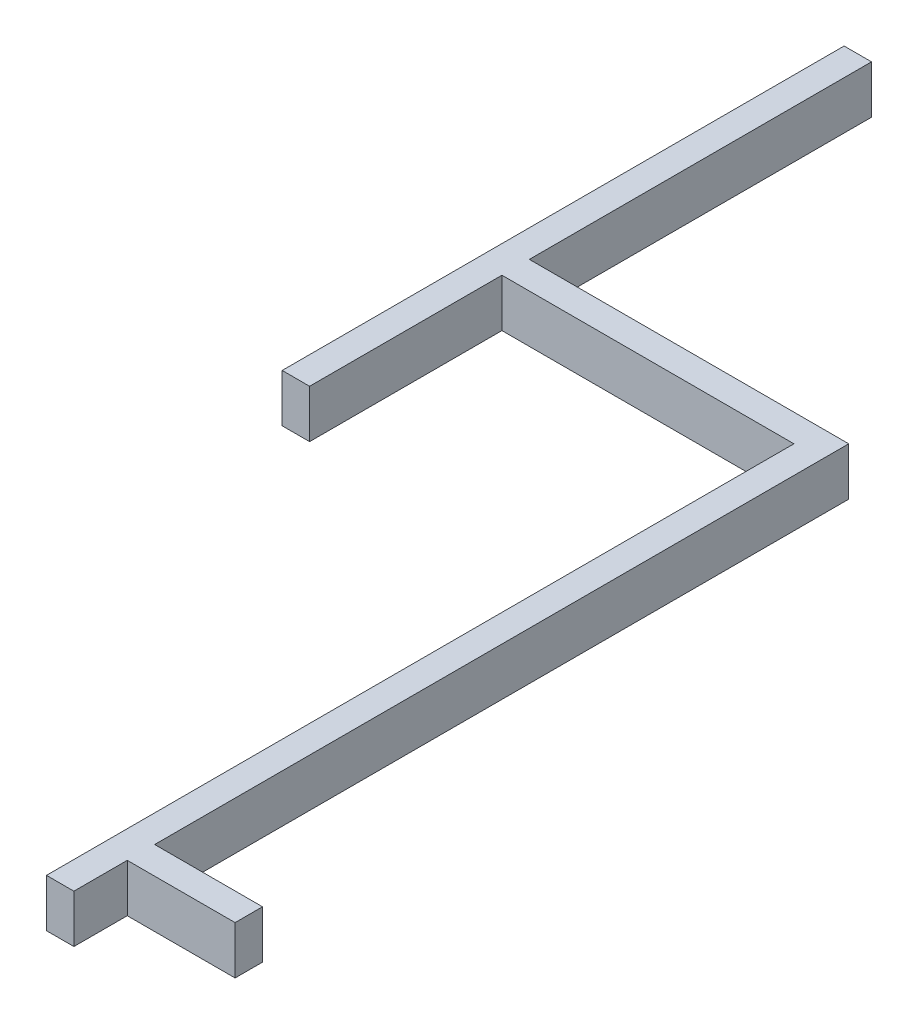
ISO-10303-21;
HEADER;
FILE_DESCRIPTION(('STEP AP214'),'2;1');
FILE_NAME('part.step','',(''),(''),'','','');
FILE_SCHEMA(('AUTOMOTIVE_DESIGN { 1 0 10303 214 1 1 1 1 }'));
ENDSEC;
DATA;
#1=APPLICATION_CONTEXT('core data for automotive mechanical design processes');
#2=APPLICATION_PROTOCOL_DEFINITION('international standard','automotive_design',2000,#1);
#3=PRODUCT_CONTEXT('',#1,'mechanical');
#4=PRODUCT('Part','Part','',(#3));
#5=PRODUCT_RELATED_PRODUCT_CATEGORY('part','',(#4));
#6=PRODUCT_DEFINITION_FORMATION('','',#4);
#7=PRODUCT_DEFINITION_CONTEXT('part definition',#1,'design');
#8=PRODUCT_DEFINITION('design','',#6,#7);
#9=PRODUCT_DEFINITION_SHAPE('','',#8);
#10=(LENGTH_UNIT() NAMED_UNIT(*) SI_UNIT(.MILLI.,.METRE.));
#11=(NAMED_UNIT(*) PLANE_ANGLE_UNIT() SI_UNIT($,.RADIAN.));
#12=(NAMED_UNIT(*) SI_UNIT($,.STERADIAN.) SOLID_ANGLE_UNIT());
#13=UNCERTAINTY_MEASURE_WITH_UNIT(LENGTH_MEASURE(1.E-05),#10,'distance_accuracy_value','');
#14=(GEOMETRIC_REPRESENTATION_CONTEXT(3) GLOBAL_UNCERTAINTY_ASSIGNED_CONTEXT((#13)) GLOBAL_UNIT_ASSIGNED_CONTEXT((#10,
#11,#12)) REPRESENTATION_CONTEXT('',''));
#15=CARTESIAN_POINT('',(0.,0.,0.));
#16=DIRECTION('',(0.,0.,1.));
#17=DIRECTION('',(1.,0.,0.));
#18=AXIS2_PLACEMENT_3D('',#15,#16,#17);
#19=CARTESIAN_POINT('',(0.,8.5,0.));
#20=DIRECTION('',(0.,1.,0.));
#21=DIRECTION('',(0.,0.,1.));
#22=AXIS2_PLACEMENT_3D('',#19,#20,#21);
#23=PLANE('',#22);
#24=DIRECTION('',(0.,0.,1.));
#25=VECTOR('',#24,1.);
#26=CARTESIAN_POINT('',(21.7271359769322,8.5,-62.4202218490347));
#27=LINE('',#26,#25);
#28=CARTESIAN_POINT('',(21.7271359769322,8.5,-62.4202218490347));
#29=VERTEX_POINT('',#28);
#30=CARTESIAN_POINT('',(21.7271359769322,8.5,46.6315684002395));
#31=VERTEX_POINT('',#30);
#32=EDGE_CURVE('E197',#29,#31,#27,.T.);
#33=ORIENTED_EDGE('',*,*,#32,.T.);
#34=DIRECTION('',(1.,0.,0.));
#35=VECTOR('',#34,1.);
#36=CARTESIAN_POINT('',(21.7271359769322,8.5,46.6315684002395));
#37=LINE('',#36,#35);
#38=CARTESIAN_POINT('',(25.7271359769322,8.5,46.6315684002395));
#39=VERTEX_POINT('',#38);
#40=EDGE_CURVE('E155',#31,#39,#37,.T.);
#41=ORIENTED_EDGE('',*,*,#40,.T.);
#42=DIRECTION('',(0.,0.,-1.));
#43=VECTOR('',#42,1.);
#44=CARTESIAN_POINT('',(25.7271359769322,8.5,46.6315684002395));
#45=LINE('',#44,#43);
#46=CARTESIAN_POINT('',(25.7271359769322,8.5,38.8445006443693));
#47=VERTEX_POINT('',#46);
#48=EDGE_CURVE('E235',#39,#47,#45,.T.);
#49=ORIENTED_EDGE('',*,*,#48,.T.);
#50=DIRECTION('',(1.,0.,0.));
#51=VECTOR('',#50,1.);
#52=CARTESIAN_POINT('',(25.7271359769322,8.5,38.8445006443693));
#53=LINE('',#52,#51);
#54=CARTESIAN_POINT('',(41.4595117428691,8.5,38.8445006443693));
#55=VERTEX_POINT('',#54);
#56=EDGE_CURVE('E237',#47,#55,#53,.T.);
#57=ORIENTED_EDGE('',*,*,#56,.T.);
#58=DIRECTION('',(0.,0.,-1.));
#59=VECTOR('',#58,1.);
#60=CARTESIAN_POINT('',(41.4595117428691,8.5,38.8445006443693));
#61=LINE('',#60,#59);
#62=CARTESIAN_POINT('',(41.4595117428691,8.5,34.8445006443693));
#63=VERTEX_POINT('',#62);
#64=EDGE_CURVE('E239',#55,#63,#61,.T.);
#65=ORIENTED_EDGE('',*,*,#64,.T.);
#66=DIRECTION('',(-1.,0.,0.));
#67=VECTOR('',#66,1.);
#68=CARTESIAN_POINT('',(41.4595117428691,8.5,34.8445006443693));
#69=LINE('',#68,#67);
#70=CARTESIAN_POINT('',(25.7271359769322,8.5,34.8445006443693));
#71=VERTEX_POINT('',#70);
#72=EDGE_CURVE('E245',#63,#71,#69,.T.);
#73=ORIENTED_EDGE('',*,*,#72,.T.);
#74=DIRECTION('',(0.,0.,-1.));
#75=VECTOR('',#74,1.);
#76=CARTESIAN_POINT('',(25.7271359769322,8.5,34.8445006443693));
#77=LINE('',#76,#75);
#78=CARTESIAN_POINT('',(25.7271359769322,8.5,-66.4202218490347));
#79=VERTEX_POINT('',#78);
#80=EDGE_CURVE('E247',#71,#79,#77,.T.);
#81=ORIENTED_EDGE('',*,*,#80,.T.);
#82=DIRECTION('',(-1.,0.,0.));
#83=VECTOR('',#82,1.);
#84=CARTESIAN_POINT('',(25.7271359769322,8.5,-66.4202218490347));
#85=LINE('',#84,#83);
#86=CARTESIAN_POINT('',(-20.8725593297671,8.5,-66.4202218490347));
#87=VERTEX_POINT('',#86);
#88=EDGE_CURVE('E249',#79,#87,#85,.T.);
#89=ORIENTED_EDGE('',*,*,#88,.T.);
#90=DIRECTION('',(0.,0.,-1.));
#91=VECTOR('',#90,1.);
#92=CARTESIAN_POINT('',(-20.8725593297671,8.5,-66.4202218490347));
#93=LINE('',#92,#91);
#94=CARTESIAN_POINT('',(-20.8725593297671,8.5,-116.344219932516));
#95=VERTEX_POINT('',#94);
#96=EDGE_CURVE('E251',#87,#95,#93,.T.);
#97=ORIENTED_EDGE('',*,*,#96,.T.);
#98=DIRECTION('',(-1.,0.,0.));
#99=VECTOR('',#98,1.);
#100=CARTESIAN_POINT('',(-20.8725593297671,8.5,-116.344219932516));
#101=LINE('',#100,#99);
#102=CARTESIAN_POINT('',(-24.8725593297671,8.5,-116.344219932516));
#103=VERTEX_POINT('',#102);
#104=EDGE_CURVE('E253',#95,#103,#101,.T.);
#105=ORIENTED_EDGE('',*,*,#104,.T.);
#106=DIRECTION('',(0.,0.,1.));
#107=VECTOR('',#106,1.);
#108=CARTESIAN_POINT('',(-24.8725593297671,8.5,-116.344219932516));
#109=LINE('',#108,#107);
#110=CARTESIAN_POINT('',(-24.8725593297671,8.5,-34.3580383260494));
#111=VERTEX_POINT('',#110);
#112=EDGE_CURVE('E255',#103,#111,#109,.T.);
#113=ORIENTED_EDGE('',*,*,#112,.T.);
#114=DIRECTION('',(1.,0.,0.));
#115=VECTOR('',#114,1.);
#116=CARTESIAN_POINT('',(-24.8725593297671,8.5,-34.3580383260494));
#117=LINE('',#116,#115);
#118=CARTESIAN_POINT('',(-20.8725593297671,8.5,-34.3580383260494));
#119=VERTEX_POINT('',#118);
#120=EDGE_CURVE('E257',#111,#119,#117,.T.);
#121=ORIENTED_EDGE('',*,*,#120,.T.);
#122=DIRECTION('',(0.,0.,-1.));
#123=VECTOR('',#122,1.);
#124=CARTESIAN_POINT('',(-20.8725593297671,8.5,-34.3580383260494));
#125=LINE('',#124,#123);
#126=CARTESIAN_POINT('',(-20.8725593297671,8.5,-62.4202218490347));
#127=VERTEX_POINT('',#126);
#128=EDGE_CURVE('E258',#119,#127,#125,.T.);
#129=ORIENTED_EDGE('',*,*,#128,.T.);
#130=DIRECTION('',(1.,0.,0.));
#131=VECTOR('',#130,1.);
#132=CARTESIAN_POINT('',(-20.8725593297671,8.5,-62.4202218490347));
#133=LINE('',#132,#131);
#134=EDGE_CURVE('E61',#127,#29,#133,.T.);
#135=ORIENTED_EDGE('',*,*,#134,.T.);
#136=EDGE_LOOP('',(#33,#41,#49,#57,#65,#73,#81,#89,#97,#105,#113,#121,#129,#135));
#137=FACE_BOUND('',#136,.T.);
#138=ADVANCED_FACE('F45',(#137),#23,.T.);
#139=CARTESIAN_POINT('',(25.7271359769322,8.5,46.6315684002395));
#140=DIRECTION('',(-1.,0.,0.));
#141=DIRECTION('',(0.,0.,1.));
#142=AXIS2_PLACEMENT_3D('',#139,#140,#141);
#143=PLANE('',#142);
#144=DIRECTION('',(0.,0.,-1.));
#145=VECTOR('',#144,1.);
#146=CARTESIAN_POINT('',(25.7271359769322,1.5,46.6315684002395));
#147=LINE('',#146,#145);
#148=CARTESIAN_POINT('',(25.7271359769322,1.5,46.6315684002395));
#149=VERTEX_POINT('',#148);
#150=CARTESIAN_POINT('',(25.7271359769322,1.5,38.8445006443693));
#151=VERTEX_POINT('',#150);
#152=EDGE_CURVE('E148',#149,#151,#147,.T.);
#153=ORIENTED_EDGE('',*,*,#152,.T.);
#154=DIRECTION('',(0.,-1.,0.));
#155=VECTOR('',#154,1.);
#156=CARTESIAN_POINT('',(25.7271359769322,8.5,38.8445006443693));
#157=LINE('',#156,#155);
#158=EDGE_CURVE('E229',#47,#151,#157,.T.);
#159=ORIENTED_EDGE('',*,*,#158,.F.);
#160=ORIENTED_EDGE('',*,*,#48,.F.);
#161=DIRECTION('',(0.,-1.,0.));
#162=VECTOR('',#161,1.);
#163=CARTESIAN_POINT('',(25.7271359769322,8.5,46.6315684002395));
#164=LINE('',#163,#162);
#165=EDGE_CURVE('E54',#39,#149,#164,.T.);
#166=ORIENTED_EDGE('',*,*,#165,.T.);
#167=EDGE_LOOP('',(#153,#159,#160,#166));
#168=FACE_BOUND('',#167,.T.);
#169=ADVANCED_FACE('F233',(#168),#143,.F.);
#170=CARTESIAN_POINT('',(25.7271359769322,8.5,38.8445006443693));
#171=DIRECTION('',(0.,0.,-1.));
#172=DIRECTION('',(-1.,0.,0.));
#173=AXIS2_PLACEMENT_3D('',#170,#171,#172);
#174=PLANE('',#173);
#175=DIRECTION('',(1.,0.,0.));
#176=VECTOR('',#175,1.);
#177=CARTESIAN_POINT('',(25.7271359769322,1.5,38.8445006443693));
#178=LINE('',#177,#176);
#179=CARTESIAN_POINT('',(41.4595117428691,1.5,38.8445006443693));
#180=VERTEX_POINT('',#179);
#181=EDGE_CURVE('E165',#151,#180,#178,.T.);
#182=ORIENTED_EDGE('',*,*,#181,.T.);
#183=DIRECTION('',(0.,-1.,0.));
#184=VECTOR('',#183,1.);
#185=CARTESIAN_POINT('',(41.4595117428691,8.5,38.8445006443693));
#186=LINE('',#185,#184);
#187=EDGE_CURVE('E226',#55,#180,#186,.T.);
#188=ORIENTED_EDGE('',*,*,#187,.F.);
#189=ORIENTED_EDGE('',*,*,#56,.F.);
#190=ORIENTED_EDGE('',*,*,#158,.T.);
#191=EDGE_LOOP('',(#182,#188,#189,#190));
#192=FACE_BOUND('',#191,.T.);
#193=ADVANCED_FACE('F299',(#192),#174,.F.);
#194=CARTESIAN_POINT('',(41.4595117428691,8.5,38.8445006443693));
#195=DIRECTION('',(-1.,0.,0.));
#196=DIRECTION('',(0.,0.,1.));
#197=AXIS2_PLACEMENT_3D('',#194,#195,#196);
#198=PLANE('',#197);
#199=DIRECTION('',(0.,0.,-1.));
#200=VECTOR('',#199,1.);
#201=CARTESIAN_POINT('',(41.4595117428691,1.5,38.8445006443693));
#202=LINE('',#201,#200);
#203=CARTESIAN_POINT('',(41.4595117428691,1.5,34.8445006443693));
#204=VERTEX_POINT('',#203);
#205=EDGE_CURVE('E168',#180,#204,#202,.T.);
#206=ORIENTED_EDGE('',*,*,#205,.T.);
#207=DIRECTION('',(0.,-1.,0.));
#208=VECTOR('',#207,1.);
#209=CARTESIAN_POINT('',(41.4595117428691,8.5,34.8445006443693));
#210=LINE('',#209,#208);
#211=EDGE_CURVE('E223',#63,#204,#210,.T.);
#212=ORIENTED_EDGE('',*,*,#211,.F.);
#213=ORIENTED_EDGE('',*,*,#64,.F.);
#214=ORIENTED_EDGE('',*,*,#187,.T.);
#215=EDGE_LOOP('',(#206,#212,#213,#214));
#216=FACE_BOUND('',#215,.T.);
#217=ADVANCED_FACE('F296',(#216),#198,.F.);
#218=CARTESIAN_POINT('',(41.4595117428691,8.5,34.8445006443693));
#219=DIRECTION('',(0.,0.,1.));
#220=DIRECTION('',(1.,0.,0.));
#221=AXIS2_PLACEMENT_3D('',#218,#219,#220);
#222=PLANE('',#221);
#223=DIRECTION('',(-1.,0.,0.));
#224=VECTOR('',#223,1.);
#225=CARTESIAN_POINT('',(41.4595117428691,1.5,34.8445006443693));
#226=LINE('',#225,#224);
#227=CARTESIAN_POINT('',(25.7271359769322,1.5,34.8445006443693));
#228=VERTEX_POINT('',#227);
#229=EDGE_CURVE('E171',#204,#228,#226,.T.);
#230=ORIENTED_EDGE('',*,*,#229,.T.);
#231=DIRECTION('',(0.,-1.,0.));
#232=VECTOR('',#231,1.);
#233=CARTESIAN_POINT('',(25.7271359769322,8.5,34.8445006443693));
#234=LINE('',#233,#232);
#235=EDGE_CURVE('E220',#71,#228,#234,.T.);
#236=ORIENTED_EDGE('',*,*,#235,.F.);
#237=ORIENTED_EDGE('',*,*,#72,.F.);
#238=ORIENTED_EDGE('',*,*,#211,.T.);
#239=EDGE_LOOP('',(#230,#236,#237,#238));
#240=FACE_BOUND('',#239,.T.);
#241=ADVANCED_FACE('F291',(#240),#222,.F.);
#242=CARTESIAN_POINT('',(25.7271359769322,8.5,34.8445006443693));
#243=DIRECTION('',(-1.,0.,0.));
#244=DIRECTION('',(0.,0.,1.));
#245=AXIS2_PLACEMENT_3D('',#242,#243,#244);
#246=PLANE('',#245);
#247=DIRECTION('',(0.,0.,-1.));
#248=VECTOR('',#247,1.);
#249=CARTESIAN_POINT('',(25.7271359769322,1.5,34.8445006443693));
#250=LINE('',#249,#248);
#251=CARTESIAN_POINT('',(25.7271359769322,1.5,-66.4202218490347));
#252=VERTEX_POINT('',#251);
#253=EDGE_CURVE('E174',#228,#252,#250,.T.);
#254=ORIENTED_EDGE('',*,*,#253,.T.);
#255=DIRECTION('',(0.,-1.,0.));
#256=VECTOR('',#255,1.);
#257=CARTESIAN_POINT('',(25.7271359769322,8.5,-66.4202218490347));
#258=LINE('',#257,#256);
#259=EDGE_CURVE('E217',#79,#252,#258,.T.);
#260=ORIENTED_EDGE('',*,*,#259,.F.);
#261=ORIENTED_EDGE('',*,*,#80,.F.);
#262=ORIENTED_EDGE('',*,*,#235,.T.);
#263=EDGE_LOOP('',(#254,#260,#261,#262));
#264=FACE_BOUND('',#263,.T.);
#265=ADVANCED_FACE('F288',(#264),#246,.F.);
#266=CARTESIAN_POINT('',(25.7271359769322,8.5,-66.4202218490347));
#267=DIRECTION('',(0.,0.,1.));
#268=DIRECTION('',(1.,0.,0.));
#269=AXIS2_PLACEMENT_3D('',#266,#267,#268);
#270=PLANE('',#269);
#271=DIRECTION('',(-1.,0.,0.));
#272=VECTOR('',#271,1.);
#273=CARTESIAN_POINT('',(25.7271359769322,1.5,-66.4202218490347));
#274=LINE('',#273,#272);
#275=CARTESIAN_POINT('',(-20.8725593297671,1.5,-66.4202218490347));
#276=VERTEX_POINT('',#275);
#277=EDGE_CURVE('E177',#252,#276,#274,.T.);
#278=ORIENTED_EDGE('',*,*,#277,.T.);
#279=DIRECTION('',(0.,-1.,0.));
#280=VECTOR('',#279,1.);
#281=CARTESIAN_POINT('',(-20.8725593297671,8.5,-66.4202218490347));
#282=LINE('',#281,#280);
#283=EDGE_CURVE('E214',#87,#276,#282,.T.);
#284=ORIENTED_EDGE('',*,*,#283,.F.);
#285=ORIENTED_EDGE('',*,*,#88,.F.);
#286=ORIENTED_EDGE('',*,*,#259,.T.);
#287=EDGE_LOOP('',(#278,#284,#285,#286));
#288=FACE_BOUND('',#287,.T.);
#289=ADVANCED_FACE('F283',(#288),#270,.F.);
#290=CARTESIAN_POINT('',(-20.8725593297671,8.5,-66.4202218490347));
#291=DIRECTION('',(-1.,0.,0.));
#292=DIRECTION('',(0.,0.,1.));
#293=AXIS2_PLACEMENT_3D('',#290,#291,#292);
#294=PLANE('',#293);
#295=DIRECTION('',(0.,0.,-1.));
#296=VECTOR('',#295,1.);
#297=CARTESIAN_POINT('',(-20.8725593297671,1.5,-66.4202218490347));
#298=LINE('',#297,#296);
#299=CARTESIAN_POINT('',(-20.8725593297671,1.5,-116.344219932516));
#300=VERTEX_POINT('',#299);
#301=EDGE_CURVE('E180',#276,#300,#298,.T.);
#302=ORIENTED_EDGE('',*,*,#301,.T.);
#303=DIRECTION('',(0.,-1.,0.));
#304=VECTOR('',#303,1.);
#305=CARTESIAN_POINT('',(-20.8725593297671,8.5,-116.344219932516));
#306=LINE('',#305,#304);
#307=EDGE_CURVE('E211',#95,#300,#306,.T.);
#308=ORIENTED_EDGE('',*,*,#307,.F.);
#309=ORIENTED_EDGE('',*,*,#96,.F.);
#310=ORIENTED_EDGE('',*,*,#283,.T.);
#311=EDGE_LOOP('',(#302,#308,#309,#310));
#312=FACE_BOUND('',#311,.T.);
#313=ADVANCED_FACE('F280',(#312),#294,.F.);
#314=CARTESIAN_POINT('',(-20.8725593297671,8.5,-116.344219932516));
#315=DIRECTION('',(0.,0.,1.));
#316=DIRECTION('',(1.,0.,0.));
#317=AXIS2_PLACEMENT_3D('',#314,#315,#316);
#318=PLANE('',#317);
#319=DIRECTION('',(-1.,0.,0.));
#320=VECTOR('',#319,1.);
#321=CARTESIAN_POINT('',(-20.8725593297671,1.5,-116.344219932516));
#322=LINE('',#321,#320);
#323=CARTESIAN_POINT('',(-24.8725593297671,1.5,-116.344219932516));
#324=VERTEX_POINT('',#323);
#325=EDGE_CURVE('E183',#300,#324,#322,.T.);
#326=ORIENTED_EDGE('',*,*,#325,.T.);
#327=DIRECTION('',(0.,-1.,0.));
#328=VECTOR('',#327,1.);
#329=CARTESIAN_POINT('',(-24.8725593297671,8.5,-116.344219932516));
#330=LINE('',#329,#328);
#331=EDGE_CURVE('E208',#103,#324,#330,.T.);
#332=ORIENTED_EDGE('',*,*,#331,.F.);
#333=ORIENTED_EDGE('',*,*,#104,.F.);
#334=ORIENTED_EDGE('',*,*,#307,.T.);
#335=EDGE_LOOP('',(#326,#332,#333,#334));
#336=FACE_BOUND('',#335,.T.);
#337=ADVANCED_FACE('F275',(#336),#318,.F.);
#338=CARTESIAN_POINT('',(-24.8725593297671,8.5,-116.344219932516));
#339=DIRECTION('',(1.,0.,0.));
#340=DIRECTION('',(0.,0.,-1.));
#341=AXIS2_PLACEMENT_3D('',#338,#339,#340);
#342=PLANE('',#341);
#343=DIRECTION('',(0.,0.,1.));
#344=VECTOR('',#343,1.);
#345=CARTESIAN_POINT('',(-24.8725593297671,1.5,-116.344219932516));
#346=LINE('',#345,#344);
#347=CARTESIAN_POINT('',(-24.8725593297671,1.5,-34.3580383260494));
#348=VERTEX_POINT('',#347);
#349=EDGE_CURVE('E186',#324,#348,#346,.T.);
#350=ORIENTED_EDGE('',*,*,#349,.T.);
#351=DIRECTION('',(0.,-1.,0.));
#352=VECTOR('',#351,1.);
#353=CARTESIAN_POINT('',(-24.8725593297671,8.5,-34.3580383260494));
#354=LINE('',#353,#352);
#355=EDGE_CURVE('E205',#111,#348,#354,.T.);
#356=ORIENTED_EDGE('',*,*,#355,.F.);
#357=ORIENTED_EDGE('',*,*,#112,.F.);
#358=ORIENTED_EDGE('',*,*,#331,.T.);
#359=EDGE_LOOP('',(#350,#356,#357,#358));
#360=FACE_BOUND('',#359,.T.);
#361=ADVANCED_FACE('F272',(#360),#342,.F.);
#362=CARTESIAN_POINT('',(-24.8725593297671,8.5,-34.3580383260494));
#363=DIRECTION('',(0.,0.,-1.));
#364=DIRECTION('',(-1.,0.,0.));
#365=AXIS2_PLACEMENT_3D('',#362,#363,#364);
#366=PLANE('',#365);
#367=DIRECTION('',(1.,0.,0.));
#368=VECTOR('',#367,1.);
#369=CARTESIAN_POINT('',(-24.8725593297671,1.5,-34.3580383260494));
#370=LINE('',#369,#368);
#371=CARTESIAN_POINT('',(-20.8725593297671,1.5,-34.3580383260494));
#372=VERTEX_POINT('',#371);
#373=EDGE_CURVE('E189',#348,#372,#370,.T.);
#374=ORIENTED_EDGE('',*,*,#373,.T.);
#375=DIRECTION('',(0.,-1.,0.));
#376=VECTOR('',#375,1.);
#377=CARTESIAN_POINT('',(-20.8725593297671,8.5,-34.3580383260494));
#378=LINE('',#377,#376);
#379=EDGE_CURVE('E202',#119,#372,#378,.T.);
#380=ORIENTED_EDGE('',*,*,#379,.F.);
#381=ORIENTED_EDGE('',*,*,#120,.F.);
#382=ORIENTED_EDGE('',*,*,#355,.T.);
#383=EDGE_LOOP('',(#374,#380,#381,#382));
#384=FACE_BOUND('',#383,.T.);
#385=ADVANCED_FACE('F268',(#384),#366,.F.);
#386=CARTESIAN_POINT('',(-20.8725593297671,8.5,-34.3580383260494));
#387=DIRECTION('',(-1.,0.,0.));
#388=DIRECTION('',(0.,0.,1.));
#389=AXIS2_PLACEMENT_3D('',#386,#387,#388);
#390=PLANE('',#389);
#391=DIRECTION('',(0.,0.,-1.));
#392=VECTOR('',#391,1.);
#393=CARTESIAN_POINT('',(-20.8725593297671,1.5,-34.3580383260494));
#394=LINE('',#393,#392);
#395=CARTESIAN_POINT('',(-20.8725593297671,1.5,-62.4202218490347));
#396=VERTEX_POINT('',#395);
#397=EDGE_CURVE('E192',#372,#396,#394,.T.);
#398=ORIENTED_EDGE('',*,*,#397,.T.);
#399=DIRECTION('',(0.,-1.,0.));
#400=VECTOR('',#399,1.);
#401=CARTESIAN_POINT('',(-20.8725593297671,8.5,-62.4202218490347));
#402=LINE('',#401,#400);
#403=EDGE_CURVE('E199',#127,#396,#402,.T.);
#404=ORIENTED_EDGE('',*,*,#403,.F.);
#405=ORIENTED_EDGE('',*,*,#128,.F.);
#406=ORIENTED_EDGE('',*,*,#379,.T.);
#407=EDGE_LOOP('',(#398,#404,#405,#406));
#408=FACE_BOUND('',#407,.T.);
#409=ADVANCED_FACE('F264',(#408),#390,.F.);
#410=CARTESIAN_POINT('',(-20.8725593297671,8.5,-62.4202218490347));
#411=DIRECTION('',(0.,0.,-1.));
#412=DIRECTION('',(-1.,0.,0.));
#413=AXIS2_PLACEMENT_3D('',#410,#411,#412);
#414=PLANE('',#413);
#415=DIRECTION('',(1.,0.,0.));
#416=VECTOR('',#415,1.);
#417=CARTESIAN_POINT('',(-20.8725593297671,1.5,-62.4202218490347));
#418=LINE('',#417,#416);
#419=CARTESIAN_POINT('',(21.7271359769322,1.5,-62.4202218490347));
#420=VERTEX_POINT('',#419);
#421=EDGE_CURVE('E195',#396,#420,#418,.T.);
#422=ORIENTED_EDGE('',*,*,#421,.T.);
#423=DIRECTION('',(0.,-1.,0.));
#424=VECTOR('',#423,1.);
#425=CARTESIAN_POINT('',(21.7271359769322,8.5,-62.4202218490347));
#426=LINE('',#425,#424);
#427=EDGE_CURVE('E159',#29,#420,#426,.T.);
#428=ORIENTED_EDGE('',*,*,#427,.F.);
#429=ORIENTED_EDGE('',*,*,#134,.F.);
#430=ORIENTED_EDGE('',*,*,#403,.T.);
#431=EDGE_LOOP('',(#422,#428,#429,#430));
#432=FACE_BOUND('',#431,.T.);
#433=ADVANCED_FACE('F266',(#432),#414,.F.);
#434=CARTESIAN_POINT('',(21.7271359769322,8.5,-62.4202218490347));
#435=DIRECTION('',(1.,0.,0.));
#436=DIRECTION('',(0.,0.,-1.));
#437=AXIS2_PLACEMENT_3D('',#434,#435,#436);
#438=PLANE('',#437);
#439=DIRECTION('',(0.,0.,1.));
#440=VECTOR('',#439,1.);
#441=CARTESIAN_POINT('',(21.7271359769322,1.5,-62.4202218490347));
#442=LINE('',#441,#440);
#443=CARTESIAN_POINT('',(21.7271359769322,1.5,46.6315684002395));
#444=VERTEX_POINT('',#443);
#445=EDGE_CURVE('E145',#420,#444,#442,.T.);
#446=ORIENTED_EDGE('',*,*,#445,.T.);
#447=DIRECTION('',(0.,-1.,0.));
#448=VECTOR('',#447,1.);
#449=CARTESIAN_POINT('',(21.7271359769322,8.5,46.6315684002395));
#450=LINE('',#449,#448);
#451=EDGE_CURVE('E11',#31,#444,#450,.T.);
#452=ORIENTED_EDGE('',*,*,#451,.F.);
#453=ORIENTED_EDGE('',*,*,#32,.F.);
#454=ORIENTED_EDGE('',*,*,#427,.T.);
#455=EDGE_LOOP('',(#446,#452,#453,#454));
#456=FACE_BOUND('',#455,.T.);
#457=ADVANCED_FACE('F47',(#456),#438,.F.);
#458=CARTESIAN_POINT('',(21.7271359769322,8.5,46.6315684002395));
#459=DIRECTION('',(0.,0.,-1.));
#460=DIRECTION('',(-1.,0.,0.));
#461=AXIS2_PLACEMENT_3D('',#458,#459,#460);
#462=PLANE('',#461);
#463=DIRECTION('',(1.,0.,0.));
#464=VECTOR('',#463,1.);
#465=CARTESIAN_POINT('',(21.7271359769322,1.5,46.6315684002395));
#466=LINE('',#465,#464);
#467=EDGE_CURVE('E142',#444,#149,#466,.T.);
#468=ORIENTED_EDGE('',*,*,#467,.T.);
#469=ORIENTED_EDGE('',*,*,#165,.F.);
#470=ORIENTED_EDGE('',*,*,#40,.F.);
#471=ORIENTED_EDGE('',*,*,#451,.T.);
#472=EDGE_LOOP('',(#468,#469,#470,#471));
#473=FACE_BOUND('',#472,.T.);
#474=ADVANCED_FACE('F154',(#473),#462,.F.);
#475=CARTESIAN_POINT('',(47.5073696761609,1.5,-119.697794886589));
#476=DIRECTION('',(0.,1.,0.));
#477=DIRECTION('',(0.,0.,1.));
#478=AXIS2_PLACEMENT_3D('',#475,#476,#477);
#479=PLANE('',#478);
#480=ORIENTED_EDGE('',*,*,#467,.F.);
#481=ORIENTED_EDGE('',*,*,#445,.F.);
#482=ORIENTED_EDGE('',*,*,#421,.F.);
#483=ORIENTED_EDGE('',*,*,#397,.F.);
#484=ORIENTED_EDGE('',*,*,#373,.F.);
#485=ORIENTED_EDGE('',*,*,#349,.F.);
#486=ORIENTED_EDGE('',*,*,#325,.F.);
#487=ORIENTED_EDGE('',*,*,#301,.F.);
#488=ORIENTED_EDGE('',*,*,#277,.F.);
#489=ORIENTED_EDGE('',*,*,#253,.F.);
#490=ORIENTED_EDGE('',*,*,#229,.F.);
#491=ORIENTED_EDGE('',*,*,#205,.F.);
#492=ORIENTED_EDGE('',*,*,#181,.F.);
#493=ORIENTED_EDGE('',*,*,#152,.F.);
#494=EDGE_LOOP('',(#480,#481,#482,#483,#484,#485,#486,#487,#488,#489,#490,#491,#492,#493));
#495=FACE_BOUND('',#494,.T.);
#496=ADVANCED_FACE('F143',(#495),#479,.F.);
#497=CLOSED_SHELL('',(#138,#169,#193,#217,#241,#265,#289,#313,#337,#361,#385,#409,#433,#457,
#474,#496));
#498=MANIFOLD_SOLID_BREP('B2',#497);
#499=ADVANCED_BREP_SHAPE_REPRESENTATION('',(#18,#498),#14);
#500=SHAPE_DEFINITION_REPRESENTATION(#9,#499);
ENDSEC;
END-ISO-10303-21;
